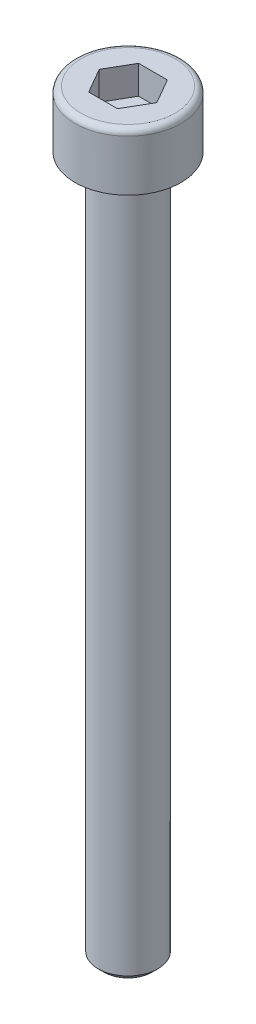
ISO-10303-21;
HEADER;
FILE_DESCRIPTION(('STEP AP214'),'2;1');
FILE_NAME('part.step','',(''),(''),'','','');
FILE_SCHEMA(('AUTOMOTIVE_DESIGN { 1 0 10303 214 1 1 1 1 }'));
ENDSEC;
DATA;
#1=APPLICATION_CONTEXT('core data for automotive mechanical design processes');
#2=APPLICATION_PROTOCOL_DEFINITION('international standard','automotive_design',2000,#1);
#3=PRODUCT_CONTEXT('',#1,'mechanical');
#4=PRODUCT('Part','Part','',(#3));
#5=PRODUCT_RELATED_PRODUCT_CATEGORY('part','',(#4));
#6=PRODUCT_DEFINITION_FORMATION('','',#4);
#7=PRODUCT_DEFINITION_CONTEXT('part definition',#1,'design');
#8=PRODUCT_DEFINITION('design','',#6,#7);
#9=PRODUCT_DEFINITION_SHAPE('','',#8);
#10=(LENGTH_UNIT() NAMED_UNIT(*) SI_UNIT(.MILLI.,.METRE.));
#11=(NAMED_UNIT(*) PLANE_ANGLE_UNIT() SI_UNIT($,.RADIAN.));
#12=(NAMED_UNIT(*) SI_UNIT($,.STERADIAN.) SOLID_ANGLE_UNIT());
#13=UNCERTAINTY_MEASURE_WITH_UNIT(LENGTH_MEASURE(1.E-05),#10,'distance_accuracy_value','');
#14=(GEOMETRIC_REPRESENTATION_CONTEXT(3) GLOBAL_UNCERTAINTY_ASSIGNED_CONTEXT((#13)) GLOBAL_UNIT_ASSIGNED_CONTEXT((#10,
#11,#12)) REPRESENTATION_CONTEXT('',''));
#15=CARTESIAN_POINT('',(0.,0.,0.));
#16=DIRECTION('',(0.,0.,1.));
#17=DIRECTION('',(1.,0.,0.));
#18=AXIS2_PLACEMENT_3D('',#15,#16,#17);
#19=CARTESIAN_POINT('',(1.5,-35.,0.));
#20=DIRECTION('',(0.,-1.,0.));
#21=DIRECTION('',(0.,0.,-1.));
#22=AXIS2_PLACEMENT_3D('',#19,#20,#21);
#23=PLANE('',#22);
#24=CARTESIAN_POINT('',(0.,-35.,0.));
#25=DIRECTION('',(0.,-1.,0.));
#26=DIRECTION('',(0.,0.,-1.));
#27=AXIS2_PLACEMENT_3D('',#24,#25,#26);
#28=CIRCLE('',#27,1.2);
#29=CARTESIAN_POINT('',(0.,-35.,-1.2));
#30=VERTEX_POINT('',#29);
#31=EDGE_CURVE('E147',#30,#30,#28,.T.);
#32=ORIENTED_EDGE('',*,*,#31,.T.);
#33=EDGE_LOOP('',(#32));
#34=FACE_BOUND('',#33,.T.);
#35=ADVANCED_FACE('F34',(#34),#23,.T.);
#36=CARTESIAN_POINT('',(0.,2.86,0.));
#37=DIRECTION('',(0.,1.,0.));
#38=DIRECTION('',(0.,0.,1.));
#39=AXIS2_PLACEMENT_3D('',#36,#37,#38);
#40=PLANE('',#39);
#41=DIRECTION('',(1.,0.,0.));
#42=VECTOR('',#41,1.);
#43=CARTESIAN_POINT('',(-0.721687836487032,2.86,1.25));
#44=LINE('',#43,#42);
#45=CARTESIAN_POINT('',(-0.721687836487032,2.86,1.25));
#46=VERTEX_POINT('',#45);
#47=CARTESIAN_POINT('',(0.721687836487033,2.86,1.25));
#48=VERTEX_POINT('',#47);
#49=EDGE_CURVE('E49',#46,#48,#44,.T.);
#50=ORIENTED_EDGE('',*,*,#49,.F.);
#51=DIRECTION('',(0.5,0.,0.866025403784439));
#52=VECTOR('',#51,1.);
#53=CARTESIAN_POINT('',(-1.44337567297406,2.86,0.));
#54=LINE('',#53,#52);
#55=CARTESIAN_POINT('',(-1.44337567297406,2.86,0.));
#56=VERTEX_POINT('',#55);
#57=EDGE_CURVE('E132',#56,#46,#54,.T.);
#58=ORIENTED_EDGE('',*,*,#57,.F.);
#59=DIRECTION('',(-0.5,0.,0.866025403784439));
#60=VECTOR('',#59,1.);
#61=CARTESIAN_POINT('',(-0.721687836487033,2.86,-1.25));
#62=LINE('',#61,#60);
#63=CARTESIAN_POINT('',(-0.721687836487033,2.86,-1.25));
#64=VERTEX_POINT('',#63);
#65=EDGE_CURVE('E130',#64,#56,#62,.T.);
#66=ORIENTED_EDGE('',*,*,#65,.F.);
#67=DIRECTION('',(-1.,0.,0.));
#68=VECTOR('',#67,1.);
#69=CARTESIAN_POINT('',(0.721687836487032,2.86,-1.25));
#70=LINE('',#69,#68);
#71=CARTESIAN_POINT('',(0.721687836487032,2.86,-1.25));
#72=VERTEX_POINT('',#71);
#73=EDGE_CURVE('E97',#72,#64,#70,.T.);
#74=ORIENTED_EDGE('',*,*,#73,.F.);
#75=DIRECTION('',(-0.5,0.,-0.866025403784438));
#76=VECTOR('',#75,1.);
#77=CARTESIAN_POINT('',(1.44337567297406,2.86,0.));
#78=LINE('',#77,#76);
#79=CARTESIAN_POINT('',(1.44337567297406,2.86,0.));
#80=VERTEX_POINT('',#79);
#81=EDGE_CURVE('E126',#80,#72,#78,.T.);
#82=ORIENTED_EDGE('',*,*,#81,.F.);
#83=DIRECTION('',(0.5,0.,-0.866025403784439));
#84=VECTOR('',#83,1.);
#85=CARTESIAN_POINT('',(0.721687836487033,2.86,1.25));
#86=LINE('',#85,#84);
#87=EDGE_CURVE('E123',#48,#80,#86,.T.);
#88=ORIENTED_EDGE('',*,*,#87,.F.);
#89=EDGE_LOOP('',(#50,#58,#66,#74,#82,#88));
#90=FACE_BOUND('',#89,.T.);
#91=CARTESIAN_POINT('',(0.,2.86,0.));
#92=DIRECTION('',(0.,1.,0.));
#93=DIRECTION('',(0.,0.,1.));
#94=AXIS2_PLACEMENT_3D('',#91,#92,#93);
#95=CIRCLE('',#94,2.36);
#96=CARTESIAN_POINT('',(0.,2.86,2.36));
#97=VERTEX_POINT('',#96);
#98=EDGE_CURVE('E11',#97,#97,#95,.T.);
#99=ORIENTED_EDGE('',*,*,#98,.T.);
#100=EDGE_LOOP('',(#99));
#101=FACE_BOUND('',#100,.T.);
#102=ADVANCED_FACE('F172',(#90,#101),#40,.T.);
#103=CARTESIAN_POINT('',(0.,2.86,0.));
#104=DIRECTION('',(0.,-1.,0.));
#105=DIRECTION('',(0.,0.,-1.));
#106=AXIS2_PLACEMENT_3D('',#103,#104,#105);
#107=CYLINDRICAL_SURFACE('',#106,2.66);
#108=CARTESIAN_POINT('',(0.,2.56,0.));
#109=DIRECTION('',(0.,1.,0.));
#110=DIRECTION('',(0.,0.,1.));
#111=AXIS2_PLACEMENT_3D('',#108,#109,#110);
#112=CIRCLE('',#111,2.66);
#113=CARTESIAN_POINT('',(0.,2.56,2.66));
#114=VERTEX_POINT('',#113);
#115=EDGE_CURVE('E42',#114,#114,#112,.F.);
#116=ORIENTED_EDGE('',*,*,#115,.T.);
#117=EDGE_LOOP('',(#116));
#118=FACE_BOUND('',#117,.T.);
#119=CARTESIAN_POINT('',(0.,0.,0.));
#120=DIRECTION('',(0.,-1.,0.));
#121=DIRECTION('',(0.,0.,-1.));
#122=AXIS2_PLACEMENT_3D('',#119,#120,#121);
#123=CIRCLE('',#122,2.66);
#124=CARTESIAN_POINT('',(0.,0.,-2.66));
#125=VERTEX_POINT('',#124);
#126=EDGE_CURVE('E144',#125,#125,#123,.T.);
#127=ORIENTED_EDGE('',*,*,#126,.F.);
#128=EDGE_LOOP('',(#127));
#129=FACE_BOUND('',#128,.T.);
#130=ADVANCED_FACE('F155',(#118,#129),#107,.T.);
#131=CARTESIAN_POINT('',(2.66,0.,0.));
#132=DIRECTION('',(0.,-1.,0.));
#133=DIRECTION('',(0.,0.,-1.));
#134=AXIS2_PLACEMENT_3D('',#131,#132,#133);
#135=PLANE('',#134);
#136=ORIENTED_EDGE('',*,*,#126,.T.);
#137=EDGE_LOOP('',(#136));
#138=FACE_BOUND('',#137,.T.);
#139=CARTESIAN_POINT('',(0.,0.,0.));
#140=DIRECTION('',(0.,-1.,0.));
#141=DIRECTION('',(0.,0.,-1.));
#142=AXIS2_PLACEMENT_3D('',#139,#140,#141);
#143=CIRCLE('',#142,1.5);
#144=CARTESIAN_POINT('',(0.,0.,-1.5));
#145=VERTEX_POINT('',#144);
#146=EDGE_CURVE('E136',#145,#145,#143,.T.);
#147=ORIENTED_EDGE('',*,*,#146,.F.);
#148=EDGE_LOOP('',(#147));
#149=FACE_BOUND('',#148,.T.);
#150=ADVANCED_FACE('F183',(#138,#149),#135,.T.);
#151=CARTESIAN_POINT('',(0.,2.86,0.));
#152=DIRECTION('',(0.,-1.,0.));
#153=DIRECTION('',(0.,0.,-1.));
#154=AXIS2_PLACEMENT_3D('',#151,#152,#153);
#155=CYLINDRICAL_SURFACE('',#154,1.5);
#156=CARTESIAN_POINT('',(0.,-34.7,0.));
#157=DIRECTION('',(0.,-1.,0.));
#158=DIRECTION('',(0.,0.,-1.));
#159=AXIS2_PLACEMENT_3D('',#156,#157,#158);
#160=CIRCLE('',#159,1.5);
#161=CARTESIAN_POINT('',(0.,-34.7,-1.5));
#162=VERTEX_POINT('',#161);
#163=EDGE_CURVE('E150',#162,#162,#160,.F.);
#164=ORIENTED_EDGE('',*,*,#163,.T.);
#165=EDGE_LOOP('',(#164));
#166=FACE_BOUND('',#165,.T.);
#167=ORIENTED_EDGE('',*,*,#146,.T.);
#168=EDGE_LOOP('',(#167));
#169=FACE_BOUND('',#168,.T.);
#170=ADVANCED_FACE('F168',(#166,#169),#155,.T.);
#171=CARTESIAN_POINT('',(0.,-35.,0.));
#172=DIRECTION('',(0.,1.,0.));
#173=DIRECTION('',(0.,0.,1.));
#174=AXIS2_PLACEMENT_3D('',#171,#172,#173);
#175=CONICAL_SURFACE('',#174,1.2,0.785398163397444);
#176=ORIENTED_EDGE('',*,*,#163,.F.);
#177=EDGE_LOOP('',(#176));
#178=FACE_BOUND('',#177,.T.);
#179=ORIENTED_EDGE('',*,*,#31,.F.);
#180=EDGE_LOOP('',(#179));
#181=FACE_BOUND('',#180,.T.);
#182=ADVANCED_FACE('F160',(#178,#181),#175,.T.);
#183=CARTESIAN_POINT('',(0.,2.56,0.));
#184=DIRECTION('',(0.,1.,0.));
#185=DIRECTION('',(0.,0.,1.));
#186=AXIS2_PLACEMENT_3D('',#183,#184,#185);
#187=TOROIDAL_SURFACE('',#186,2.36,0.3);
#188=ORIENTED_EDGE('',*,*,#98,.F.);
#189=EDGE_LOOP('',(#188));
#190=FACE_BOUND('',#189,.T.);
#191=ORIENTED_EDGE('',*,*,#115,.F.);
#192=EDGE_LOOP('',(#191));
#193=FACE_BOUND('',#192,.T.);
#194=ADVANCED_FACE('F36',(#190,#193),#187,.T.);
#195=CARTESIAN_POINT('',(-0.721687836487032,1.43,1.25));
#196=DIRECTION('',(0.,0.,1.));
#197=DIRECTION('',(1.,0.,0.));
#198=AXIS2_PLACEMENT_3D('',#195,#196,#197);
#199=PLANE('',#198);
#200=ORIENTED_EDGE('',*,*,#49,.T.);
#201=DIRECTION('',(0.,1.,0.));
#202=VECTOR('',#201,1.);
#203=CARTESIAN_POINT('',(0.721687836487033,1.43,1.25));
#204=LINE('',#203,#202);
#205=CARTESIAN_POINT('',(0.721687836487033,1.43,1.25));
#206=VERTEX_POINT('',#205);
#207=EDGE_CURVE('E79',#206,#48,#204,.T.);
#208=ORIENTED_EDGE('',*,*,#207,.F.);
#209=DIRECTION('',(1.,0.,0.));
#210=VECTOR('',#209,1.);
#211=CARTESIAN_POINT('',(-0.721687836487032,1.43,1.25));
#212=LINE('',#211,#210);
#213=CARTESIAN_POINT('',(-0.721687836487032,1.43,1.25));
#214=VERTEX_POINT('',#213);
#215=EDGE_CURVE('E134',#214,#206,#212,.T.);
#216=ORIENTED_EDGE('',*,*,#215,.F.);
#217=DIRECTION('',(0.,1.,0.));
#218=VECTOR('',#217,1.);
#219=CARTESIAN_POINT('',(-0.721687836487032,1.43,1.25));
#220=LINE('',#219,#218);
#221=EDGE_CURVE('E57',#214,#46,#220,.T.);
#222=ORIENTED_EDGE('',*,*,#221,.T.);
#223=EDGE_LOOP('',(#200,#208,#216,#222));
#224=FACE_BOUND('',#223,.T.);
#225=ADVANCED_FACE('F159',(#224),#199,.F.);
#226=CARTESIAN_POINT('',(-1.44337567297406,1.43,0.));
#227=DIRECTION('',(-0.866025403784439,0.,0.5));
#228=DIRECTION('',(0.5,0.,0.866025403784439));
#229=AXIS2_PLACEMENT_3D('',#226,#227,#228);
#230=PLANE('',#229);
#231=ORIENTED_EDGE('',*,*,#57,.T.);
#232=ORIENTED_EDGE('',*,*,#221,.F.);
#233=DIRECTION('',(0.5,0.,0.866025403784439));
#234=VECTOR('',#233,1.);
#235=CARTESIAN_POINT('',(-1.44337567297406,1.43,0.));
#236=LINE('',#235,#234);
#237=CARTESIAN_POINT('',(-1.44337567297406,1.43,0.));
#238=VERTEX_POINT('',#237);
#239=EDGE_CURVE('E109',#238,#214,#236,.T.);
#240=ORIENTED_EDGE('',*,*,#239,.F.);
#241=DIRECTION('',(0.,1.,0.));
#242=VECTOR('',#241,1.);
#243=CARTESIAN_POINT('',(-1.44337567297406,1.43,0.));
#244=LINE('',#243,#242);
#245=EDGE_CURVE('E101',#238,#56,#244,.T.);
#246=ORIENTED_EDGE('',*,*,#245,.T.);
#247=EDGE_LOOP('',(#231,#232,#240,#246));
#248=FACE_BOUND('',#247,.T.);
#249=ADVANCED_FACE('F166',(#248),#230,.F.);
#250=CARTESIAN_POINT('',(-0.721687836487033,1.43,-1.25));
#251=DIRECTION('',(-0.866025403784439,0.,-0.5));
#252=DIRECTION('',(-0.5,0.,0.866025403784439));
#253=AXIS2_PLACEMENT_3D('',#250,#251,#252);
#254=PLANE('',#253);
#255=ORIENTED_EDGE('',*,*,#65,.T.);
#256=ORIENTED_EDGE('',*,*,#245,.F.);
#257=DIRECTION('',(-0.5,0.,0.866025403784439));
#258=VECTOR('',#257,1.);
#259=CARTESIAN_POINT('',(-0.721687836487033,1.43,-1.25));
#260=LINE('',#259,#258);
#261=CARTESIAN_POINT('',(-0.721687836487033,1.43,-1.25));
#262=VERTEX_POINT('',#261);
#263=EDGE_CURVE('E105',#262,#238,#260,.T.);
#264=ORIENTED_EDGE('',*,*,#263,.F.);
#265=DIRECTION('',(0.,1.,0.));
#266=VECTOR('',#265,1.);
#267=CARTESIAN_POINT('',(-0.721687836487033,1.43,-1.25));
#268=LINE('',#267,#266);
#269=EDGE_CURVE('E90',#262,#64,#268,.T.);
#270=ORIENTED_EDGE('',*,*,#269,.T.);
#271=EDGE_LOOP('',(#255,#256,#264,#270));
#272=FACE_BOUND('',#271,.T.);
#273=ADVANCED_FACE('F106',(#272),#254,.F.);
#274=CARTESIAN_POINT('',(0.721687836487032,1.43,-1.25));
#275=DIRECTION('',(0.,0.,-1.));
#276=DIRECTION('',(-1.,0.,0.));
#277=AXIS2_PLACEMENT_3D('',#274,#275,#276);
#278=PLANE('',#277);
#279=ORIENTED_EDGE('',*,*,#73,.T.);
#280=ORIENTED_EDGE('',*,*,#269,.F.);
#281=DIRECTION('',(-1.,0.,0.));
#282=VECTOR('',#281,1.);
#283=CARTESIAN_POINT('',(0.721687836487032,1.43,-1.25));
#284=LINE('',#283,#282);
#285=CARTESIAN_POINT('',(0.721687836487032,1.43,-1.25));
#286=VERTEX_POINT('',#285);
#287=EDGE_CURVE('E94',#286,#262,#284,.T.);
#288=ORIENTED_EDGE('',*,*,#287,.F.);
#289=DIRECTION('',(0.,1.,0.));
#290=VECTOR('',#289,1.);
#291=CARTESIAN_POINT('',(0.721687836487032,1.43,-1.25));
#292=LINE('',#291,#290);
#293=EDGE_CURVE('E102',#286,#72,#292,.T.);
#294=ORIENTED_EDGE('',*,*,#293,.T.);
#295=EDGE_LOOP('',(#279,#280,#288,#294));
#296=FACE_BOUND('',#295,.T.);
#297=ADVANCED_FACE('F92',(#296),#278,.F.);
#298=CARTESIAN_POINT('',(1.44337567297406,1.43,0.));
#299=DIRECTION('',(0.866025403784438,0.,-0.5));
#300=DIRECTION('',(-0.5,0.,-0.866025403784438));
#301=AXIS2_PLACEMENT_3D('',#298,#299,#300);
#302=PLANE('',#301);
#303=ORIENTED_EDGE('',*,*,#81,.T.);
#304=ORIENTED_EDGE('',*,*,#293,.F.);
#305=DIRECTION('',(-0.5,0.,-0.866025403784438));
#306=VECTOR('',#305,1.);
#307=CARTESIAN_POINT('',(1.44337567297406,1.43,0.));
#308=LINE('',#307,#306);
#309=CARTESIAN_POINT('',(1.44337567297406,1.43,0.));
#310=VERTEX_POINT('',#309);
#311=EDGE_CURVE('E115',#310,#286,#308,.T.);
#312=ORIENTED_EDGE('',*,*,#311,.F.);
#313=DIRECTION('',(0.,1.,0.));
#314=VECTOR('',#313,1.);
#315=CARTESIAN_POINT('',(1.44337567297406,1.43,0.));
#316=LINE('',#315,#314);
#317=EDGE_CURVE('E139',#310,#80,#316,.T.);
#318=ORIENTED_EDGE('',*,*,#317,.T.);
#319=EDGE_LOOP('',(#303,#304,#312,#318));
#320=FACE_BOUND('',#319,.T.);
#321=ADVANCED_FACE('F193',(#320),#302,.F.);
#322=CARTESIAN_POINT('',(0.721687836487033,1.43,1.25));
#323=DIRECTION('',(0.866025403784439,0.,0.5));
#324=DIRECTION('',(0.5,0.,-0.866025403784439));
#325=AXIS2_PLACEMENT_3D('',#322,#323,#324);
#326=PLANE('',#325);
#327=ORIENTED_EDGE('',*,*,#87,.T.);
#328=ORIENTED_EDGE('',*,*,#317,.F.);
#329=DIRECTION('',(0.5,0.,-0.866025403784439));
#330=VECTOR('',#329,1.);
#331=CARTESIAN_POINT('',(0.721687836487033,1.43,1.25));
#332=LINE('',#331,#330);
#333=EDGE_CURVE('E117',#206,#310,#332,.T.);
#334=ORIENTED_EDGE('',*,*,#333,.F.);
#335=ORIENTED_EDGE('',*,*,#207,.T.);
#336=EDGE_LOOP('',(#327,#328,#334,#335));
#337=FACE_BOUND('',#336,.T.);
#338=ADVANCED_FACE('F190',(#337),#326,.F.);
#339=CARTESIAN_POINT('',(0.,1.43,0.));
#340=DIRECTION('',(0.,1.,0.));
#341=DIRECTION('',(0.,0.,1.));
#342=AXIS2_PLACEMENT_3D('',#339,#340,#341);
#343=PLANE('',#342);
#344=ORIENTED_EDGE('',*,*,#215,.T.);
#345=ORIENTED_EDGE('',*,*,#333,.T.);
#346=ORIENTED_EDGE('',*,*,#311,.T.);
#347=ORIENTED_EDGE('',*,*,#287,.T.);
#348=ORIENTED_EDGE('',*,*,#263,.T.);
#349=ORIENTED_EDGE('',*,*,#239,.T.);
#350=EDGE_LOOP('',(#344,#345,#346,#347,#348,#349));
#351=FACE_BOUND('',#350,.T.);
#352=ADVANCED_FACE('F112',(#351),#343,.T.);
#353=CLOSED_SHELL('',(#35,#102,#130,#150,#170,#182,#194,#225,#249,#273,#297,#321,#338,#352));
#354=MANIFOLD_SOLID_BREP('B2',#353);
#355=ADVANCED_BREP_SHAPE_REPRESENTATION('',(#18,#354),#14);
#356=SHAPE_DEFINITION_REPRESENTATION(#9,#355);
ENDSEC;
END-ISO-10303-21;
